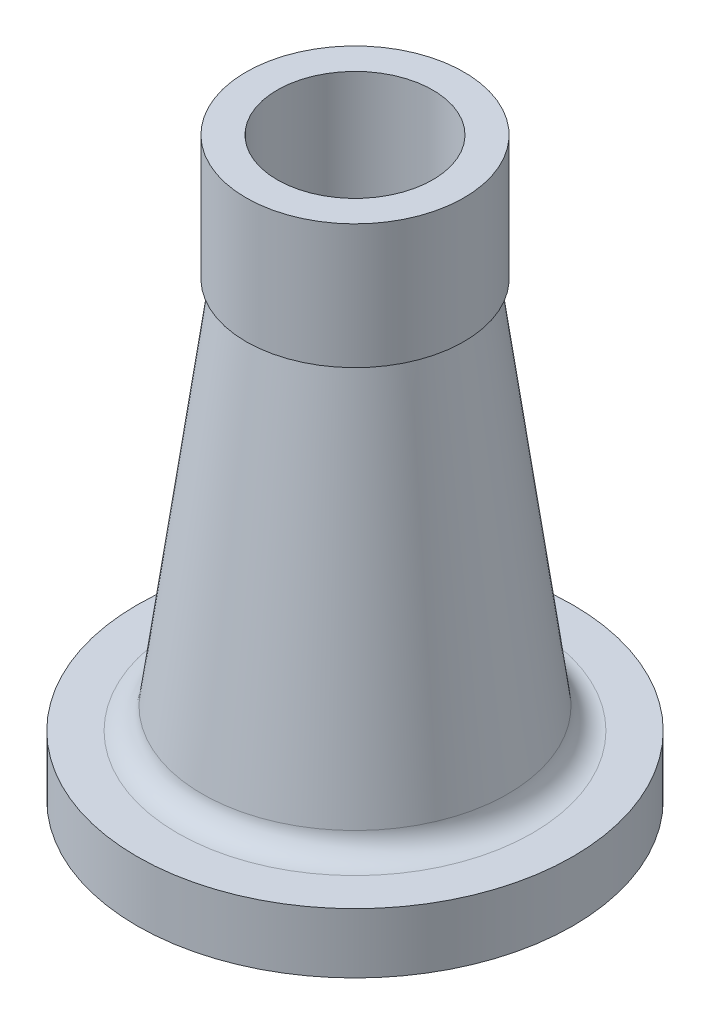
ISO-10303-21;
HEADER;
FILE_DESCRIPTION(('STEP AP214'),'2;1');
FILE_NAME('part.step','',(''),(''),'','','');
FILE_SCHEMA(('AUTOMOTIVE_DESIGN { 1 0 10303 214 1 1 1 1 }'));
ENDSEC;
DATA;
#1=APPLICATION_CONTEXT('core data for automotive mechanical design processes');
#2=APPLICATION_PROTOCOL_DEFINITION('international standard','automotive_design',2000,#1);
#3=PRODUCT_CONTEXT('',#1,'mechanical');
#4=PRODUCT('Part','Part','',(#3));
#5=PRODUCT_RELATED_PRODUCT_CATEGORY('part','',(#4));
#6=PRODUCT_DEFINITION_FORMATION('','',#4);
#7=PRODUCT_DEFINITION_CONTEXT('part definition',#1,'design');
#8=PRODUCT_DEFINITION('design','',#6,#7);
#9=PRODUCT_DEFINITION_SHAPE('','',#8);
#10=(LENGTH_UNIT() NAMED_UNIT(*) SI_UNIT(.MILLI.,.METRE.));
#11=(NAMED_UNIT(*) PLANE_ANGLE_UNIT() SI_UNIT($,.RADIAN.));
#12=(NAMED_UNIT(*) SI_UNIT($,.STERADIAN.) SOLID_ANGLE_UNIT());
#13=UNCERTAINTY_MEASURE_WITH_UNIT(LENGTH_MEASURE(1.E-05),#10,'distance_accuracy_value','');
#14=(GEOMETRIC_REPRESENTATION_CONTEXT(3) GLOBAL_UNCERTAINTY_ASSIGNED_CONTEXT((#13)) GLOBAL_UNIT_ASSIGNED_CONTEXT((#10,
#11,#12)) REPRESENTATION_CONTEXT('',''));
#15=CARTESIAN_POINT('',(0.,0.,0.));
#16=DIRECTION('',(0.,0.,1.));
#17=DIRECTION('',(1.,0.,0.));
#18=AXIS2_PLACEMENT_3D('',#15,#16,#17);
#19=CARTESIAN_POINT('',(0.,2.99963443865346,0.));
#20=DIRECTION('',(0.,-1.,0.));
#21=DIRECTION('',(0.,0.,-1.));
#22=AXIS2_PLACEMENT_3D('',#19,#20,#21);
#23=PLANE('',#22);
#24=CARTESIAN_POINT('',(0.,2.99963443865348,0.));
#25=DIRECTION('',(0.,1.,0.));
#26=DIRECTION('',(0.,0.,1.));
#27=AXIS2_PLACEMENT_3D('',#24,#25,#26);
#28=CIRCLE('',#27,42.1100000000001);
#29=CARTESIAN_POINT('',(0.,2.99963443865348,42.1100000000001));
#30=VERTEX_POINT('',#29);
#31=EDGE_CURVE('E78',#30,#30,#28,.T.);
#32=ORIENTED_EDGE('',*,*,#31,.T.);
#33=EDGE_LOOP('',(#32));
#34=FACE_BOUND('',#33,.T.);
#35=CARTESIAN_POINT('',(0.,2.99963443865348,0.));
#36=DIRECTION('',(0.,1.,0.));
#37=DIRECTION('',(0.,0.,1.));
#38=AXIS2_PLACEMENT_3D('',#35,#36,#37);
#39=CIRCLE('',#38,50.);
#40=CARTESIAN_POINT('',(0.,2.99963443865348,50.));
#41=VERTEX_POINT('',#40);
#42=EDGE_CURVE('E48',#41,#41,#39,.T.);
#43=ORIENTED_EDGE('',*,*,#42,.F.);
#44=EDGE_LOOP('',(#43));
#45=FACE_BOUND('',#44,.T.);
#46=ADVANCED_FACE('F37',(#34,#45),#23,.T.);
#47=CARTESIAN_POINT('',(0.,280.669685719542,0.));
#48=DIRECTION('',(0.,1.,0.));
#49=DIRECTION('',(0.,0.,1.));
#50=AXIS2_PLACEMENT_3D('',#47,#48,#49);
#51=CYLINDRICAL_SURFACE('',#50,50.);
#52=ORIENTED_EDGE('',*,*,#42,.T.);
#53=EDGE_LOOP('',(#52));
#54=FACE_BOUND('',#53,.T.);
#55=CARTESIAN_POINT('',(0.,0.,0.));
#56=DIRECTION('',(0.,1.,0.));
#57=DIRECTION('',(0.,0.,1.));
#58=AXIS2_PLACEMENT_3D('',#55,#56,#57);
#59=CIRCLE('',#58,50.);
#60=CARTESIAN_POINT('',(0.,0.,50.));
#61=VERTEX_POINT('',#60);
#62=EDGE_CURVE('E52',#61,#61,#59,.T.);
#63=ORIENTED_EDGE('',*,*,#62,.F.);
#64=EDGE_LOOP('',(#63));
#65=FACE_BOUND('',#64,.T.);
#66=ADVANCED_FACE('F124',(#54,#65),#51,.F.);
#67=CARTESIAN_POINT('',(0.,0.,0.));
#68=DIRECTION('',(0.,1.,0.));
#69=DIRECTION('',(0.,0.,1.));
#70=AXIS2_PLACEMENT_3D('',#67,#68,#69);
#71=PLANE('',#70);
#72=CARTESIAN_POINT('',(0.,0.,0.));
#73=DIRECTION('',(0.,1.,0.));
#74=DIRECTION('',(0.,0.,1.));
#75=AXIS2_PLACEMENT_3D('',#72,#73,#74);
#76=CIRCLE('',#75,70.);
#77=CARTESIAN_POINT('',(0.,0.,70.));
#78=VERTEX_POINT('',#77);
#79=EDGE_CURVE('E57',#78,#78,#76,.T.);
#80=ORIENTED_EDGE('',*,*,#79,.F.);
#81=EDGE_LOOP('',(#80));
#82=FACE_BOUND('',#81,.T.);
#83=ORIENTED_EDGE('',*,*,#62,.T.);
#84=EDGE_LOOP('',(#83));
#85=FACE_BOUND('',#84,.T.);
#86=ADVANCED_FACE('F128',(#82,#85),#71,.F.);
#87=CARTESIAN_POINT('',(0.,280.669685719542,0.));
#88=DIRECTION('',(0.,1.,0.));
#89=DIRECTION('',(0.,0.,1.));
#90=AXIS2_PLACEMENT_3D('',#87,#88,#89);
#91=CYLINDRICAL_SURFACE('',#90,70.);
#92=CARTESIAN_POINT('',(0.,19.277093337013,0.));
#93=DIRECTION('',(0.,1.,0.));
#94=DIRECTION('',(0.,0.,1.));
#95=AXIS2_PLACEMENT_3D('',#92,#93,#94);
#96=CIRCLE('',#95,70.);
#97=CARTESIAN_POINT('',(0.,19.277093337013,70.));
#98=VERTEX_POINT('',#97);
#99=EDGE_CURVE('E60',#98,#98,#96,.T.);
#100=ORIENTED_EDGE('',*,*,#99,.F.);
#101=EDGE_LOOP('',(#100));
#102=FACE_BOUND('',#101,.T.);
#103=ORIENTED_EDGE('',*,*,#79,.T.);
#104=EDGE_LOOP('',(#103));
#105=FACE_BOUND('',#104,.T.);
#106=ADVANCED_FACE('F121',(#102,#105),#91,.T.);
#107=CARTESIAN_POINT('',(0.,19.277093337013,0.));
#108=DIRECTION('',(0.,-1.,0.));
#109=DIRECTION('',(0.,0.,-1.));
#110=AXIS2_PLACEMENT_3D('',#107,#108,#109);
#111=PLANE('',#110);
#112=CARTESIAN_POINT('',(0.,19.277093337013,0.));
#113=DIRECTION('',(0.,-1.,0.));
#114=DIRECTION('',(0.,0.,-1.));
#115=AXIS2_PLACEMENT_3D('',#112,#113,#114);
#116=CIRCLE('',#115,56.9910603501281);
#117=CARTESIAN_POINT('',(0.,19.277093337013,-56.9910603501281));
#118=VERTEX_POINT('',#117);
#119=EDGE_CURVE('E10',#118,#118,#116,.T.);
#120=ORIENTED_EDGE('',*,*,#119,.T.);
#121=EDGE_LOOP('',(#120));
#122=FACE_BOUND('',#121,.T.);
#123=ORIENTED_EDGE('',*,*,#99,.T.);
#124=EDGE_LOOP('',(#123));
#125=FACE_BOUND('',#124,.T.);
#126=ADVANCED_FACE('F116',(#122,#125),#111,.F.);
#127=CARTESIAN_POINT('',(0.,19.2770933370129,0.));
#128=DIRECTION('',(0.,-1.,0.));
#129=DIRECTION('',(0.,0.,-1.));
#130=AXIS2_PLACEMENT_3D('',#127,#128,#129);
#131=CONICAL_SURFACE('',#130,50.,0.134402819877468);
#132=CARTESIAN_POINT('',(0.,26.2051050132925,0.));
#133=DIRECTION('',(0.,-1.,0.));
#134=DIRECTION('',(0.,0.,-1.));
#135=AXIS2_PLACEMENT_3D('',#132,#133,#134);
#136=CIRCLE('',#135,49.0632081167797);
#137=CARTESIAN_POINT('',(0.,26.2051050132925,-49.0632081167797));
#138=VERTEX_POINT('',#137);
#139=EDGE_CURVE('E44',#138,#138,#136,.F.);
#140=ORIENTED_EDGE('',*,*,#139,.T.);
#141=EDGE_LOOP('',(#140));
#142=FACE_BOUND('',#141,.T.);
#143=CARTESIAN_POINT('',(0.,145.,0.));
#144=DIRECTION('',(0.,1.,0.));
#145=DIRECTION('',(0.,0.,1.));
#146=AXIS2_PLACEMENT_3D('',#143,#144,#145);
#147=CIRCLE('',#146,33.);
#148=CARTESIAN_POINT('',(0.,145.,33.));
#149=VERTEX_POINT('',#148);
#150=EDGE_CURVE('E63',#149,#149,#147,.T.);
#151=ORIENTED_EDGE('',*,*,#150,.F.);
#152=EDGE_LOOP('',(#151));
#153=FACE_BOUND('',#152,.T.);
#154=ADVANCED_FACE('F111',(#142,#153),#131,.T.);
#155=CARTESIAN_POINT('',(0.,145.,0.));
#156=DIRECTION('',(0.,1.,0.));
#157=DIRECTION('',(0.,0.,1.));
#158=AXIS2_PLACEMENT_3D('',#155,#156,#157);
#159=PLANE('',#158);
#160=CARTESIAN_POINT('',(0.,145.,0.));
#161=DIRECTION('',(0.,1.,0.));
#162=DIRECTION('',(0.,0.,1.));
#163=AXIS2_PLACEMENT_3D('',#160,#161,#162);
#164=CIRCLE('',#163,35.);
#165=CARTESIAN_POINT('',(0.,145.,35.));
#166=VERTEX_POINT('',#165);
#167=EDGE_CURVE('E66',#166,#166,#164,.T.);
#168=ORIENTED_EDGE('',*,*,#167,.F.);
#169=EDGE_LOOP('',(#168));
#170=FACE_BOUND('',#169,.T.);
#171=ORIENTED_EDGE('',*,*,#150,.T.);
#172=EDGE_LOOP('',(#171));
#173=FACE_BOUND('',#172,.T.);
#174=ADVANCED_FACE('F105',(#170,#173),#159,.F.);
#175=CARTESIAN_POINT('',(0.,280.669685719542,0.));
#176=DIRECTION('',(0.,1.,0.));
#177=DIRECTION('',(0.,0.,1.));
#178=AXIS2_PLACEMENT_3D('',#175,#176,#177);
#179=CYLINDRICAL_SURFACE('',#178,35.);
#180=CARTESIAN_POINT('',(0.,185.,0.));
#181=DIRECTION('',(0.,1.,0.));
#182=DIRECTION('',(0.,0.,1.));
#183=AXIS2_PLACEMENT_3D('',#180,#181,#182);
#184=CIRCLE('',#183,35.);
#185=CARTESIAN_POINT('',(0.,185.,35.));
#186=VERTEX_POINT('',#185);
#187=EDGE_CURVE('E69',#186,#186,#184,.T.);
#188=ORIENTED_EDGE('',*,*,#187,.F.);
#189=EDGE_LOOP('',(#188));
#190=FACE_BOUND('',#189,.T.);
#191=ORIENTED_EDGE('',*,*,#167,.T.);
#192=EDGE_LOOP('',(#191));
#193=FACE_BOUND('',#192,.T.);
#194=ADVANCED_FACE('F99',(#190,#193),#179,.T.);
#195=CARTESIAN_POINT('',(0.,185.,0.));
#196=DIRECTION('',(0.,-1.,0.));
#197=DIRECTION('',(0.,0.,-1.));
#198=AXIS2_PLACEMENT_3D('',#195,#196,#197);
#199=PLANE('',#198);
#200=CARTESIAN_POINT('',(0.,185.,0.));
#201=DIRECTION('',(0.,1.,0.));
#202=DIRECTION('',(0.,0.,1.));
#203=AXIS2_PLACEMENT_3D('',#200,#201,#202);
#204=CIRCLE('',#203,24.9886474026328);
#205=CARTESIAN_POINT('',(0.,185.,24.9886474026328));
#206=VERTEX_POINT('',#205);
#207=EDGE_CURVE('E72',#206,#206,#204,.T.);
#208=ORIENTED_EDGE('',*,*,#207,.F.);
#209=EDGE_LOOP('',(#208));
#210=FACE_BOUND('',#209,.T.);
#211=ORIENTED_EDGE('',*,*,#187,.T.);
#212=EDGE_LOOP('',(#211));
#213=FACE_BOUND('',#212,.T.);
#214=ADVANCED_FACE('F93',(#210,#213),#199,.F.);
#215=CARTESIAN_POINT('',(0.,280.669685719542,0.));
#216=DIRECTION('',(0.,1.,0.));
#217=DIRECTION('',(0.,0.,1.));
#218=AXIS2_PLACEMENT_3D('',#215,#216,#217);
#219=CYLINDRICAL_SURFACE('',#218,24.9886474026328);
#220=CARTESIAN_POINT('',(0.,129.62,0.));
#221=DIRECTION('',(0.,1.,0.));
#222=DIRECTION('',(0.,0.,1.));
#223=AXIS2_PLACEMENT_3D('',#220,#221,#222);
#224=CIRCLE('',#223,24.9886474026328);
#225=CARTESIAN_POINT('',(0.,129.62,24.9886474026328));
#226=VERTEX_POINT('',#225);
#227=EDGE_CURVE('E75',#226,#226,#224,.T.);
#228=ORIENTED_EDGE('',*,*,#227,.F.);
#229=EDGE_LOOP('',(#228));
#230=FACE_BOUND('',#229,.T.);
#231=ORIENTED_EDGE('',*,*,#207,.T.);
#232=EDGE_LOOP('',(#231));
#233=FACE_BOUND('',#232,.T.);
#234=ADVANCED_FACE('F87',(#230,#233),#219,.F.);
#235=CARTESIAN_POINT('',(0.,129.62,0.));
#236=DIRECTION('',(0.,-1.,0.));
#237=DIRECTION('',(0.,0.,-1.));
#238=AXIS2_PLACEMENT_3D('',#235,#236,#237);
#239=CONICAL_SURFACE('',#238,24.9886474026328,0.134402819877468);
#240=ORIENTED_EDGE('',*,*,#31,.F.);
#241=EDGE_LOOP('',(#240));
#242=FACE_BOUND('',#241,.T.);
#243=ORIENTED_EDGE('',*,*,#227,.T.);
#244=EDGE_LOOP('',(#243));
#245=FACE_BOUND('',#244,.T.);
#246=ADVANCED_FACE('F84',(#242,#245),#239,.F.);
#247=CARTESIAN_POINT('',(0.,27.277093337013,0.));
#248=DIRECTION('',(0.,-1.,0.));
#249=DIRECTION('',(0.,0.,-1.));
#250=AXIS2_PLACEMENT_3D('',#247,#248,#249);
#251=TOROIDAL_SURFACE('',#250,56.9910603501281,8.);
#252=ORIENTED_EDGE('',*,*,#119,.F.);
#253=EDGE_LOOP('',(#252));
#254=FACE_BOUND('',#253,.T.);
#255=ORIENTED_EDGE('',*,*,#139,.F.);
#256=EDGE_LOOP('',(#255));
#257=FACE_BOUND('',#256,.T.);
#258=ADVANCED_FACE('F39',(#254,#257),#251,.F.);
#259=CLOSED_SHELL('',(#46,#66,#86,#106,#126,#154,#174,#194,#214,#234,#246,#258));
#260=MANIFOLD_SOLID_BREP('B2',#259);
#261=ADVANCED_BREP_SHAPE_REPRESENTATION('',(#18,#260),#14);
#262=SHAPE_DEFINITION_REPRESENTATION(#9,#261);
ENDSEC;
END-ISO-10303-21;
